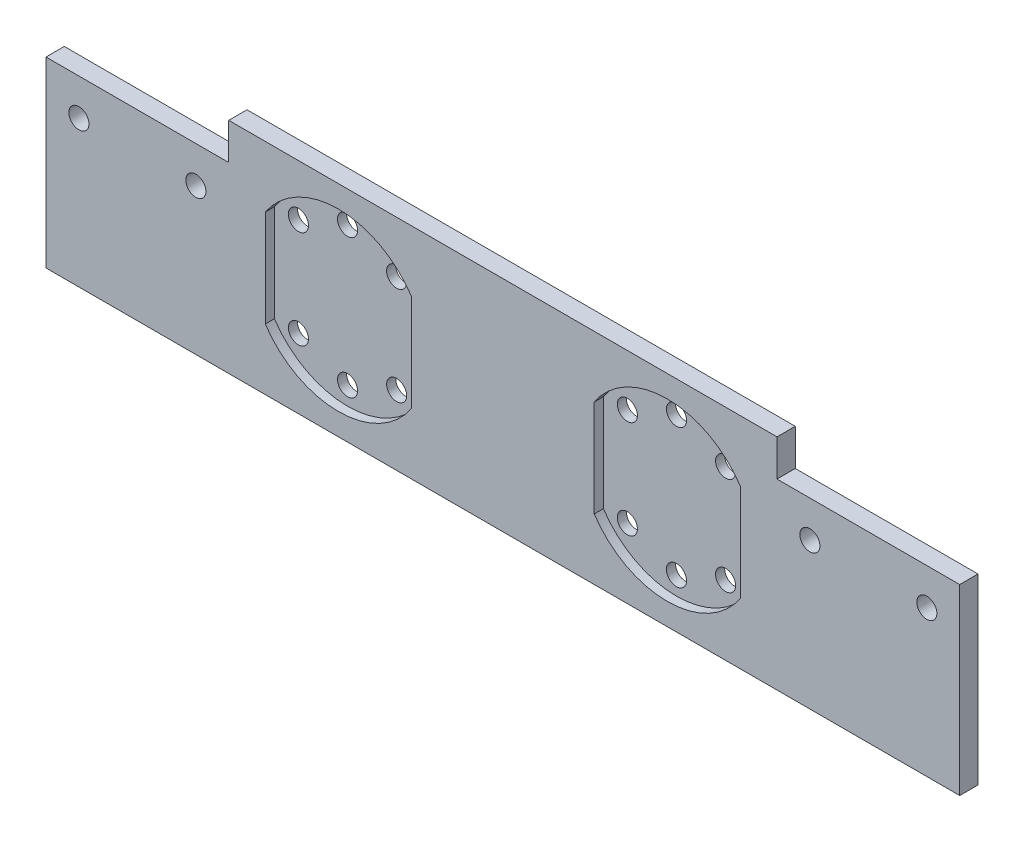
ISO-10303-21;
HEADER;
FILE_DESCRIPTION(('STEP AP214'),'2;1');
FILE_NAME('part.step','',(''),(''),'','','');
FILE_SCHEMA(('AUTOMOTIVE_DESIGN { 1 0 10303 214 1 1 1 1 }'));
ENDSEC;
DATA;
#1=APPLICATION_CONTEXT('core data for automotive mechanical design processes');
#2=APPLICATION_PROTOCOL_DEFINITION('international standard','automotive_design',2000,#1);
#3=PRODUCT_CONTEXT('',#1,'mechanical');
#4=PRODUCT('Part','Part','',(#3));
#5=PRODUCT_RELATED_PRODUCT_CATEGORY('part','',(#4));
#6=PRODUCT_DEFINITION_FORMATION('','',#4);
#7=PRODUCT_DEFINITION_CONTEXT('part definition',#1,'design');
#8=PRODUCT_DEFINITION('design','',#6,#7);
#9=PRODUCT_DEFINITION_SHAPE('','',#8);
#10=(LENGTH_UNIT() NAMED_UNIT(*) SI_UNIT(.MILLI.,.METRE.));
#11=(NAMED_UNIT(*) PLANE_ANGLE_UNIT() SI_UNIT($,.RADIAN.));
#12=(NAMED_UNIT(*) SI_UNIT($,.STERADIAN.) SOLID_ANGLE_UNIT());
#13=UNCERTAINTY_MEASURE_WITH_UNIT(LENGTH_MEASURE(1.E-05),#10,'distance_accuracy_value','');
#14=(GEOMETRIC_REPRESENTATION_CONTEXT(3) GLOBAL_UNCERTAINTY_ASSIGNED_CONTEXT((#13)) GLOBAL_UNIT_ASSIGNED_CONTEXT((#10,
#11,#12)) REPRESENTATION_CONTEXT('',''));
#15=CARTESIAN_POINT('',(0.,0.,0.));
#16=DIRECTION('',(0.,0.,1.));
#17=DIRECTION('',(1.,0.,0.));
#18=AXIS2_PLACEMENT_3D('',#15,#16,#17);
#19=CARTESIAN_POINT('',(0.,0.,0.));
#20=DIRECTION('',(0.,0.,1.));
#21=DIRECTION('',(1.,0.,0.));
#22=AXIS2_PLACEMENT_3D('',#19,#20,#21);
#23=PLANE('',#22);
#24=CARTESIAN_POINT('',(-116.,15.,0.));
#25=DIRECTION('',(0.,0.,1.));
#26=DIRECTION('',(1.,0.,0.));
#27=AXIS2_PLACEMENT_3D('',#24,#25,#26);
#28=CIRCLE('',#27,2.75000000000001);
#29=CARTESIAN_POINT('',(-113.25,15.,0.));
#30=VERTEX_POINT('',#29);
#31=EDGE_CURVE('E780',#30,#30,#28,.T.);
#32=ORIENTED_EDGE('',*,*,#31,.T.);
#33=EDGE_LOOP('',(#32));
#34=FACE_BOUND('',#33,.T.);
#35=CARTESIAN_POINT('',(116.,15.,0.));
#36=DIRECTION('',(0.,0.,1.));
#37=DIRECTION('',(-1.,0.,0.));
#38=AXIS2_PLACEMENT_3D('',#35,#36,#37);
#39=CIRCLE('',#38,2.75000000000001);
#40=CARTESIAN_POINT('',(113.25,15.,0.));
#41=VERTEX_POINT('',#40);
#42=EDGE_CURVE('E801',#41,#41,#39,.T.);
#43=ORIENTED_EDGE('',*,*,#42,.T.);
#44=EDGE_LOOP('',(#43));
#45=FACE_BOUND('',#44,.T.);
#46=CARTESIAN_POINT('',(83.9999999999996,15.,0.));
#47=DIRECTION('',(0.,0.,1.));
#48=DIRECTION('',(-1.,0.,0.));
#49=AXIS2_PLACEMENT_3D('',#46,#47,#48);
#50=CIRCLE('',#49,2.75000000000001);
#51=CARTESIAN_POINT('',(81.2499999999996,15.,0.));
#52=VERTEX_POINT('',#51);
#53=EDGE_CURVE('E795',#52,#52,#50,.T.);
#54=ORIENTED_EDGE('',*,*,#53,.T.);
#55=EDGE_LOOP('',(#54));
#56=FACE_BOUND('',#55,.T.);
#57=CARTESIAN_POINT('',(-83.9999999999996,15.,0.));
#58=DIRECTION('',(0.,0.,1.));
#59=DIRECTION('',(1.,0.,0.));
#60=AXIS2_PLACEMENT_3D('',#57,#58,#59);
#61=CIRCLE('',#60,2.75000000000001);
#62=CARTESIAN_POINT('',(-81.2499999999996,15.,0.));
#63=VERTEX_POINT('',#62);
#64=EDGE_CURVE('E790',#63,#63,#61,.T.);
#65=ORIENTED_EDGE('',*,*,#64,.T.);
#66=EDGE_LOOP('',(#65));
#67=FACE_BOUND('',#66,.T.);
#68=CARTESIAN_POINT('',(58.4400000000004,-8.43699999999997,0.));
#69=DIRECTION('',(0.,0.,1.));
#70=DIRECTION('',(1.,0.,0.));
#71=AXIS2_PLACEMENT_3D('',#68,#69,#70);
#72=CIRCLE('',#71,2.75);
#73=CARTESIAN_POINT('',(61.1900000000004,-8.43699999999997,0.));
#74=VERTEX_POINT('',#73);
#75=EDGE_CURVE('E827',#74,#74,#72,.T.);
#76=ORIENTED_EDGE('',*,*,#75,.T.);
#77=EDGE_LOOP('',(#76));
#78=FACE_BOUND('',#77,.T.);
#79=CARTESIAN_POINT('',(-31.558011299437,-8.43699999999997,0.));
#80=DIRECTION('',(0.,0.,1.));
#81=DIRECTION('',(1.,0.,0.));
#82=AXIS2_PLACEMENT_3D('',#79,#80,#81);
#83=CIRCLE('',#82,2.75);
#84=CARTESIAN_POINT('',(-28.808011299437,-8.43699999999997,0.));
#85=VERTEX_POINT('',#84);
#86=EDGE_CURVE('E822',#85,#85,#83,.T.);
#87=ORIENTED_EDGE('',*,*,#86,.T.);
#88=EDGE_LOOP('',(#87));
#89=FACE_BOUND('',#88,.T.);
#90=CARTESIAN_POINT('',(-44.9990056497187,23.9900000000001,0.));
#91=DIRECTION('',(0.,0.,1.));
#92=DIRECTION('',(1.,0.,0.));
#93=AXIS2_PLACEMENT_3D('',#90,#91,#92);
#94=CIRCLE('',#93,2.75);
#95=CARTESIAN_POINT('',(-42.2490056497187,23.9900000000001,0.));
#96=VERTEX_POINT('',#95);
#97=EDGE_CURVE('E838',#96,#96,#94,.T.);
#98=ORIENTED_EDGE('',*,*,#97,.T.);
#99=EDGE_LOOP('',(#98));
#100=FACE_BOUND('',#99,.T.);
#101=CARTESIAN_POINT('',(31.558011299437,18.4270000000001,0.));
#102=DIRECTION('',(0.,0.,1.));
#103=DIRECTION('',(1.,0.,0.));
#104=AXIS2_PLACEMENT_3D('',#101,#102,#103);
#105=CIRCLE('',#104,2.75);
#106=CARTESIAN_POINT('',(34.308011299437,18.4270000000001,0.));
#107=VERTEX_POINT('',#106);
#108=EDGE_CURVE('E810',#107,#107,#105,.T.);
#109=ORIENTED_EDGE('',*,*,#108,.T.);
#110=EDGE_LOOP('',(#109));
#111=FACE_BOUND('',#110,.T.);
#112=CARTESIAN_POINT('',(44.9990056497187,-14.,0.));
#113=DIRECTION('',(0.,0.,1.));
#114=DIRECTION('',(1.,0.,0.));
#115=AXIS2_PLACEMENT_3D('',#112,#113,#114);
#116=CIRCLE('',#115,2.75);
#117=CARTESIAN_POINT('',(47.7490056497187,-14.,0.));
#118=VERTEX_POINT('',#117);
#119=EDGE_CURVE('E808',#118,#118,#116,.T.);
#120=ORIENTED_EDGE('',*,*,#119,.T.);
#121=EDGE_LOOP('',(#120));
#122=FACE_BOUND('',#121,.T.);
#123=CARTESIAN_POINT('',(-58.4400000000004,18.4270000000001,0.));
#124=DIRECTION('',(0.,0.,1.));
#125=DIRECTION('',(1.,0.,0.));
#126=AXIS2_PLACEMENT_3D('',#123,#124,#125);
#127=CIRCLE('',#126,2.75);
#128=CARTESIAN_POINT('',(-55.6900000000004,18.4270000000001,0.));
#129=VERTEX_POINT('',#128);
#130=EDGE_CURVE('E842',#129,#129,#127,.T.);
#131=ORIENTED_EDGE('',*,*,#130,.T.);
#132=EDGE_LOOP('',(#131));
#133=FACE_BOUND('',#132,.T.);
#134=DIRECTION('',(0.,1.,0.));
#135=VECTOR('',#134,1.);
#136=CARTESIAN_POINT('',(125.,0.,0.));
#137=LINE('',#136,#135);
#138=CARTESIAN_POINT('',(125.,-25.,0.));
#139=VERTEX_POINT('',#138);
#140=CARTESIAN_POINT('',(125.,25.,0.));
#141=VERTEX_POINT('',#140);
#142=EDGE_CURVE('E11',#139,#141,#137,.T.);
#143=ORIENTED_EDGE('',*,*,#142,.F.);
#144=DIRECTION('',(1.,0.,0.));
#145=VECTOR('',#144,1.);
#146=CARTESIAN_POINT('',(-145.,-25.,0.));
#147=LINE('',#146,#145);
#148=CARTESIAN_POINT('',(-125.,-25.,0.));
#149=VERTEX_POINT('',#148);
#150=EDGE_CURVE('E322',#149,#139,#147,.T.);
#151=ORIENTED_EDGE('',*,*,#150,.F.);
#152=DIRECTION('',(0.,1.,0.));
#153=VECTOR('',#152,1.);
#154=CARTESIAN_POINT('',(-125.,0.,0.));
#155=LINE('',#154,#153);
#156=CARTESIAN_POINT('',(-125.,25.,0.));
#157=VERTEX_POINT('',#156);
#158=EDGE_CURVE('E51',#149,#157,#155,.T.);
#159=ORIENTED_EDGE('',*,*,#158,.T.);
#160=DIRECTION('',(-1.,0.,0.));
#161=VECTOR('',#160,1.);
#162=CARTESIAN_POINT('',(-145.,25.,0.));
#163=LINE('',#162,#161);
#164=CARTESIAN_POINT('',(-74.9999999999996,25.,0.));
#165=VERTEX_POINT('',#164);
#166=EDGE_CURVE('E307',#165,#157,#163,.T.);
#167=ORIENTED_EDGE('',*,*,#166,.F.);
#168=DIRECTION('',(0.,-1.,0.));
#169=VECTOR('',#168,1.);
#170=CARTESIAN_POINT('',(-74.9999999999996,35.,0.));
#171=LINE('',#170,#169);
#172=CARTESIAN_POINT('',(-74.9999999999996,35.,0.));
#173=VERTEX_POINT('',#172);
#174=EDGE_CURVE('E279',#173,#165,#171,.T.);
#175=ORIENTED_EDGE('',*,*,#174,.F.);
#176=DIRECTION('',(-1.,0.,0.));
#177=VECTOR('',#176,1.);
#178=CARTESIAN_POINT('',(74.9999999999996,35.,0.));
#179=LINE('',#178,#177);
#180=CARTESIAN_POINT('',(74.9999999999996,35.,0.));
#181=VERTEX_POINT('',#180);
#182=EDGE_CURVE('E255',#181,#173,#179,.T.);
#183=ORIENTED_EDGE('',*,*,#182,.F.);
#184=DIRECTION('',(0.,-1.,0.));
#185=VECTOR('',#184,1.);
#186=CARTESIAN_POINT('',(74.9999999999996,35.,0.));
#187=LINE('',#186,#185);
#188=CARTESIAN_POINT('',(74.9999999999996,25.,0.));
#189=VERTEX_POINT('',#188);
#190=EDGE_CURVE('E283',#181,#189,#187,.T.);
#191=ORIENTED_EDGE('',*,*,#190,.T.);
#192=EDGE_CURVE('E319',#141,#189,#163,.T.);
#193=ORIENTED_EDGE('',*,*,#192,.F.);
#194=EDGE_LOOP('',(#143,#151,#159,#167,#175,#183,#191,#193));
#195=FACE_BOUND('',#194,.T.);
#196=CARTESIAN_POINT('',(31.558011299437,-8.43699999999997,0.));
#197=DIRECTION('',(0.,0.,-1.));
#198=DIRECTION('',(-1.,0.,0.));
#199=AXIS2_PLACEMENT_3D('',#196,#197,#198);
#200=CIRCLE('',#199,2.75);
#201=CARTESIAN_POINT('',(28.808011299437,-8.43699999999997,0.));
#202=VERTEX_POINT('',#201);
#203=EDGE_CURVE('E815',#202,#202,#200,.T.);
#204=ORIENTED_EDGE('',*,*,#203,.F.);
#205=EDGE_LOOP('',(#204));
#206=FACE_BOUND('',#205,.T.);
#207=CARTESIAN_POINT('',(-31.558011299437,18.4270000000001,0.));
#208=DIRECTION('',(0.,0.,1.));
#209=DIRECTION('',(1.,0.,0.));
#210=AXIS2_PLACEMENT_3D('',#207,#208,#209);
#211=CIRCLE('',#210,2.75);
#212=CARTESIAN_POINT('',(-28.808011299437,18.4270000000001,0.));
#213=VERTEX_POINT('',#212);
#214=EDGE_CURVE('E843',#213,#213,#211,.F.);
#215=ORIENTED_EDGE('',*,*,#214,.F.);
#216=EDGE_LOOP('',(#215));
#217=FACE_BOUND('',#216,.T.);
#218=CARTESIAN_POINT('',(-58.4400000000004,-8.43699999999997,0.));
#219=DIRECTION('',(0.,0.,1.));
#220=DIRECTION('',(1.,0.,0.));
#221=AXIS2_PLACEMENT_3D('',#218,#219,#220);
#222=CIRCLE('',#221,2.75);
#223=CARTESIAN_POINT('',(-55.6900000000004,-8.43699999999997,0.));
#224=VERTEX_POINT('',#223);
#225=EDGE_CURVE('E847',#224,#224,#222,.F.);
#226=ORIENTED_EDGE('',*,*,#225,.F.);
#227=EDGE_LOOP('',(#226));
#228=FACE_BOUND('',#227,.T.);
#229=CARTESIAN_POINT('',(-44.9990056497187,-14.,0.));
#230=DIRECTION('',(0.,0.,1.));
#231=DIRECTION('',(1.,0.,0.));
#232=AXIS2_PLACEMENT_3D('',#229,#230,#231);
#233=CIRCLE('',#232,2.75);
#234=CARTESIAN_POINT('',(-42.2490056497187,-14.,0.));
#235=VERTEX_POINT('',#234);
#236=EDGE_CURVE('E826',#235,#235,#233,.F.);
#237=ORIENTED_EDGE('',*,*,#236,.F.);
#238=EDGE_LOOP('',(#237));
#239=FACE_BOUND('',#238,.T.);
#240=CARTESIAN_POINT('',(58.4400000000004,18.4270000000001,0.));
#241=DIRECTION('',(0.,0.,1.));
#242=DIRECTION('',(1.,0.,0.));
#243=AXIS2_PLACEMENT_3D('',#240,#241,#242);
#244=CIRCLE('',#243,2.75);
#245=CARTESIAN_POINT('',(61.1900000000004,18.4270000000001,0.));
#246=VERTEX_POINT('',#245);
#247=EDGE_CURVE('E831',#246,#246,#244,.F.);
#248=ORIENTED_EDGE('',*,*,#247,.F.);
#249=EDGE_LOOP('',(#248));
#250=FACE_BOUND('',#249,.T.);
#251=CARTESIAN_POINT('',(44.9990056497187,23.9900000000001,0.));
#252=DIRECTION('',(0.,0.,1.));
#253=DIRECTION('',(1.,0.,0.));
#254=AXIS2_PLACEMENT_3D('',#251,#252,#253);
#255=CIRCLE('',#254,2.75);
#256=CARTESIAN_POINT('',(47.7490056497187,23.9900000000001,0.));
#257=VERTEX_POINT('',#256);
#258=EDGE_CURVE('E814',#257,#257,#255,.F.);
#259=ORIENTED_EDGE('',*,*,#258,.F.);
#260=EDGE_LOOP('',(#259));
#261=FACE_BOUND('',#260,.T.);
#262=ADVANCED_FACE('F42',(#34,#45,#56,#67,#78,#89,#100,#111,#122,#133,#195,#206,#217,#228,#239,
#250,#261),#23,.F.);
#263=CARTESIAN_POINT('',(-145.,25.,5.));
#264=DIRECTION('',(0.,-1.,0.));
#265=DIRECTION('',(0.,0.,-1.));
#266=AXIS2_PLACEMENT_3D('',#263,#264,#265);
#267=PLANE('',#266);
#268=DIRECTION('',(0.,0.,-1.));
#269=VECTOR('',#268,1.);
#270=CARTESIAN_POINT('',(74.9999999999996,25.,0.));
#271=LINE('',#270,#269);
#272=CARTESIAN_POINT('',(74.9999999999996,25.,5.));
#273=VERTEX_POINT('',#272);
#274=EDGE_CURVE('E203',#273,#189,#271,.T.);
#275=ORIENTED_EDGE('',*,*,#274,.F.);
#276=DIRECTION('',(-1.,0.,0.));
#277=VECTOR('',#276,1.);
#278=CARTESIAN_POINT('',(-145.,25.,5.));
#279=LINE('',#278,#277);
#280=CARTESIAN_POINT('',(125.,25.,5.));
#281=VERTEX_POINT('',#280);
#282=EDGE_CURVE('E310',#281,#273,#279,.T.);
#283=ORIENTED_EDGE('',*,*,#282,.F.);
#284=DIRECTION('',(0.,0.,1.));
#285=VECTOR('',#284,1.);
#286=CARTESIAN_POINT('',(125.,25.,-5.));
#287=LINE('',#286,#285);
#288=EDGE_CURVE('E291',#141,#281,#287,.T.);
#289=ORIENTED_EDGE('',*,*,#288,.F.);
#290=ORIENTED_EDGE('',*,*,#192,.T.);
#291=EDGE_LOOP('',(#275,#283,#289,#290));
#292=FACE_BOUND('',#291,.T.);
#293=ADVANCED_FACE('F44',(#292),#267,.F.);
#294=DIRECTION('',(0.,0.,1.));
#295=VECTOR('',#294,1.);
#296=CARTESIAN_POINT('',(-74.9999999999996,25.,0.));
#297=LINE('',#296,#295);
#298=CARTESIAN_POINT('',(-74.9999999999996,25.,5.));
#299=VERTEX_POINT('',#298);
#300=EDGE_CURVE('E256',#165,#299,#297,.T.);
#301=ORIENTED_EDGE('',*,*,#300,.F.);
#302=ORIENTED_EDGE('',*,*,#166,.T.);
#303=DIRECTION('',(0.,0.,1.));
#304=VECTOR('',#303,1.);
#305=CARTESIAN_POINT('',(-125.,25.,-5.));
#306=LINE('',#305,#304);
#307=CARTESIAN_POINT('',(-125.,25.,5.));
#308=VERTEX_POINT('',#307);
#309=EDGE_CURVE('E303',#157,#308,#306,.T.);
#310=ORIENTED_EDGE('',*,*,#309,.T.);
#311=EDGE_CURVE('E315',#299,#308,#279,.T.);
#312=ORIENTED_EDGE('',*,*,#311,.F.);
#313=EDGE_LOOP('',(#301,#302,#310,#312));
#314=FACE_BOUND('',#313,.T.);
#315=ADVANCED_FACE('F345',(#314),#267,.F.);
#316=CARTESIAN_POINT('',(-145.,-25.,5.));
#317=DIRECTION('',(0.,1.,0.));
#318=DIRECTION('',(0.,0.,1.));
#319=AXIS2_PLACEMENT_3D('',#316,#317,#318);
#320=PLANE('',#319);
#321=DIRECTION('',(0.,0.,1.));
#322=VECTOR('',#321,1.);
#323=CARTESIAN_POINT('',(125.,-25.,-5.));
#324=LINE('',#323,#322);
#325=CARTESIAN_POINT('',(125.,-25.,5.));
#326=VERTEX_POINT('',#325);
#327=EDGE_CURVE('E292',#139,#326,#324,.T.);
#328=ORIENTED_EDGE('',*,*,#327,.T.);
#329=DIRECTION('',(1.,0.,0.));
#330=VECTOR('',#329,1.);
#331=CARTESIAN_POINT('',(-145.,-25.,5.));
#332=LINE('',#331,#330);
#333=CARTESIAN_POINT('',(-125.,-25.,5.));
#334=VERTEX_POINT('',#333);
#335=EDGE_CURVE('E314',#334,#326,#332,.T.);
#336=ORIENTED_EDGE('',*,*,#335,.F.);
#337=DIRECTION('',(0.,0.,1.));
#338=VECTOR('',#337,1.);
#339=CARTESIAN_POINT('',(-125.,-25.,-5.));
#340=LINE('',#339,#338);
#341=EDGE_CURVE('E302',#149,#334,#340,.T.);
#342=ORIENTED_EDGE('',*,*,#341,.F.);
#343=ORIENTED_EDGE('',*,*,#150,.T.);
#344=EDGE_LOOP('',(#328,#336,#342,#343));
#345=FACE_BOUND('',#344,.T.);
#346=ADVANCED_FACE('F340',(#345),#320,.F.);
#347=CARTESIAN_POINT('',(0.,0.,5.));
#348=DIRECTION('',(0.,0.,1.));
#349=DIRECTION('',(1.,0.,0.));
#350=AXIS2_PLACEMENT_3D('',#347,#348,#349);
#351=PLANE('',#350);
#352=CARTESIAN_POINT('',(-116.,15.,5.));
#353=DIRECTION('',(0.,0.,1.));
#354=DIRECTION('',(1.,0.,0.));
#355=AXIS2_PLACEMENT_3D('',#352,#353,#354);
#356=CIRCLE('',#355,2.75000000000001);
#357=CARTESIAN_POINT('',(-113.25,15.,5.));
#358=VERTEX_POINT('',#357);
#359=EDGE_CURVE('E783',#358,#358,#356,.T.);
#360=ORIENTED_EDGE('',*,*,#359,.F.);
#361=EDGE_LOOP('',(#360));
#362=FACE_BOUND('',#361,.T.);
#363=CARTESIAN_POINT('',(116.,15.,5.));
#364=DIRECTION('',(0.,0.,1.));
#365=DIRECTION('',(-1.,0.,0.));
#366=AXIS2_PLACEMENT_3D('',#363,#364,#365);
#367=CIRCLE('',#366,2.75000000000001);
#368=CARTESIAN_POINT('',(113.25,15.,5.));
#369=VERTEX_POINT('',#368);
#370=EDGE_CURVE('E792',#369,#369,#367,.T.);
#371=ORIENTED_EDGE('',*,*,#370,.F.);
#372=EDGE_LOOP('',(#371));
#373=FACE_BOUND('',#372,.T.);
#374=CARTESIAN_POINT('',(83.9999999999996,15.,5.));
#375=DIRECTION('',(0.,0.,1.));
#376=DIRECTION('',(-1.,0.,0.));
#377=AXIS2_PLACEMENT_3D('',#374,#375,#376);
#378=CIRCLE('',#377,2.75000000000001);
#379=CARTESIAN_POINT('',(81.2499999999996,15.,5.));
#380=VERTEX_POINT('',#379);
#381=EDGE_CURVE('E805',#380,#380,#378,.T.);
#382=ORIENTED_EDGE('',*,*,#381,.F.);
#383=EDGE_LOOP('',(#382));
#384=FACE_BOUND('',#383,.T.);
#385=CARTESIAN_POINT('',(-83.9999999999996,15.,5.));
#386=DIRECTION('',(0.,0.,1.));
#387=DIRECTION('',(1.,0.,0.));
#388=AXIS2_PLACEMENT_3D('',#385,#386,#387);
#389=CIRCLE('',#388,2.75000000000001);
#390=CARTESIAN_POINT('',(-81.2499999999996,15.,5.));
#391=VERTEX_POINT('',#390);
#392=EDGE_CURVE('E785',#391,#391,#389,.T.);
#393=ORIENTED_EDGE('',*,*,#392,.F.);
#394=EDGE_LOOP('',(#393));
#395=FACE_BOUND('',#394,.T.);
#396=CARTESIAN_POINT('',(44.9990056497187,4.99500000000005,5.));
#397=DIRECTION('',(0.,0.,1.));
#398=DIRECTION('',(-1.,0.,0.));
#399=AXIS2_PLACEMENT_3D('',#396,#397,#398);
#400=CIRCLE('',#399,24.);
#401=CARTESIAN_POINT('',(65.0000000000004,18.26,5.));
#402=VERTEX_POINT('',#401);
#403=CARTESIAN_POINT('',(25.0000000000004,18.2629980789317,5.));
#404=VERTEX_POINT('',#403);
#405=EDGE_CURVE('E58',#402,#404,#400,.T.);
#406=ORIENTED_EDGE('',*,*,#405,.F.);
#407=DIRECTION('',(0.,1.,0.));
#408=VECTOR('',#407,1.);
#409=CARTESIAN_POINT('',(65.0000000000004,18.26,5.));
#410=LINE('',#409,#408);
#411=CARTESIAN_POINT('',(65.0000000000004,-8.26999999999996,5.));
#412=VERTEX_POINT('',#411);
#413=EDGE_CURVE('E178',#412,#402,#410,.T.);
#414=ORIENTED_EDGE('',*,*,#413,.F.);
#415=CARTESIAN_POINT('',(44.9990056497187,4.99500000000005,5.));
#416=DIRECTION('',(0.,0.,1.));
#417=DIRECTION('',(1.,0.,0.));
#418=AXIS2_PLACEMENT_3D('',#415,#416,#417);
#419=CIRCLE('',#418,24.);
#420=CARTESIAN_POINT('',(25.0000000000003,-8.27299807893163,5.));
#421=VERTEX_POINT('',#420);
#422=EDGE_CURVE('E182',#421,#412,#419,.T.);
#423=ORIENTED_EDGE('',*,*,#422,.F.);
#424=DIRECTION('',(0.,-1.,0.));
#425=VECTOR('',#424,1.);
#426=CARTESIAN_POINT('',(25.0000000000004,18.2629980789317,5.));
#427=LINE('',#426,#425);
#428=EDGE_CURVE('E194',#404,#421,#427,.T.);
#429=ORIENTED_EDGE('',*,*,#428,.F.);
#430=EDGE_LOOP('',(#406,#414,#423,#429));
#431=FACE_BOUND('',#430,.T.);
#432=CARTESIAN_POINT('',(-44.9990056497187,4.99500000000005,5.));
#433=DIRECTION('',(0.,0.,1.));
#434=DIRECTION('',(-1.,0.,0.));
#435=AXIS2_PLACEMENT_3D('',#432,#433,#434);
#436=CIRCLE('',#435,24.);
#437=CARTESIAN_POINT('',(-65.0000000000004,-8.26999999999996,5.));
#438=VERTEX_POINT('',#437);
#439=CARTESIAN_POINT('',(-25.0000000000004,-8.27299807893163,5.));
#440=VERTEX_POINT('',#439);
#441=EDGE_CURVE('E66',#438,#440,#436,.T.);
#442=ORIENTED_EDGE('',*,*,#441,.F.);
#443=DIRECTION('',(0.,-1.,0.));
#444=VECTOR('',#443,1.);
#445=CARTESIAN_POINT('',(-65.0000000000004,18.26,5.));
#446=LINE('',#445,#444);
#447=CARTESIAN_POINT('',(-65.0000000000004,18.26,5.));
#448=VERTEX_POINT('',#447);
#449=EDGE_CURVE('E222',#448,#438,#446,.T.);
#450=ORIENTED_EDGE('',*,*,#449,.F.);
#451=CARTESIAN_POINT('',(-44.9990056497187,4.99500000000005,5.));
#452=DIRECTION('',(0.,0.,1.));
#453=DIRECTION('',(1.,0.,0.));
#454=AXIS2_PLACEMENT_3D('',#451,#452,#453);
#455=CIRCLE('',#454,24.);
#456=CARTESIAN_POINT('',(-25.0000000000004,18.2629980789317,5.));
#457=VERTEX_POINT('',#456);
#458=EDGE_CURVE('E226',#457,#448,#455,.T.);
#459=ORIENTED_EDGE('',*,*,#458,.F.);
#460=DIRECTION('',(0.,1.,0.));
#461=VECTOR('',#460,1.);
#462=CARTESIAN_POINT('',(-25.0000000000004,18.2629980789317,5.));
#463=LINE('',#462,#461);
#464=EDGE_CURVE('E231',#440,#457,#463,.T.);
#465=ORIENTED_EDGE('',*,*,#464,.F.);
#466=EDGE_LOOP('',(#442,#450,#459,#465));
#467=FACE_BOUND('',#466,.T.);
#468=ORIENTED_EDGE('',*,*,#335,.T.);
#469=DIRECTION('',(0.,1.,0.));
#470=VECTOR('',#469,1.);
#471=CARTESIAN_POINT('',(125.,25.,5.));
#472=LINE('',#471,#470);
#473=EDGE_CURVE('E287',#326,#281,#472,.T.);
#474=ORIENTED_EDGE('',*,*,#473,.T.);
#475=ORIENTED_EDGE('',*,*,#282,.T.);
#476=DIRECTION('',(0.,-1.,0.));
#477=VECTOR('',#476,1.);
#478=CARTESIAN_POINT('',(74.9999999999996,35.,5.));
#479=LINE('',#478,#477);
#480=CARTESIAN_POINT('',(74.9999999999996,35.,5.));
#481=VERTEX_POINT('',#480);
#482=EDGE_CURVE('E265',#481,#273,#479,.T.);
#483=ORIENTED_EDGE('',*,*,#482,.F.);
#484=DIRECTION('',(1.,0.,0.));
#485=VECTOR('',#484,1.);
#486=CARTESIAN_POINT('',(74.9999999999996,35.,5.));
#487=LINE('',#486,#485);
#488=CARTESIAN_POINT('',(-74.9999999999996,35.,5.));
#489=VERTEX_POINT('',#488);
#490=EDGE_CURVE('E262',#489,#481,#487,.T.);
#491=ORIENTED_EDGE('',*,*,#490,.F.);
#492=DIRECTION('',(0.,-1.,0.));
#493=VECTOR('',#492,1.);
#494=CARTESIAN_POINT('',(-74.9999999999996,35.,5.));
#495=LINE('',#494,#493);
#496=EDGE_CURVE('E275',#489,#299,#495,.T.);
#497=ORIENTED_EDGE('',*,*,#496,.T.);
#498=ORIENTED_EDGE('',*,*,#311,.T.);
#499=DIRECTION('',(0.,1.,0.));
#500=VECTOR('',#499,1.);
#501=CARTESIAN_POINT('',(-125.,25.,5.));
#502=LINE('',#501,#500);
#503=EDGE_CURVE('E296',#334,#308,#502,.T.);
#504=ORIENTED_EDGE('',*,*,#503,.F.);
#505=EDGE_LOOP('',(#468,#474,#475,#483,#491,#497,#498,#504));
#506=FACE_BOUND('',#505,.T.);
#507=ADVANCED_FACE('F342',(#362,#373,#384,#395,#431,#467,#506),#351,.T.);
#508=CARTESIAN_POINT('',(-125.,25.,-5.));
#509=DIRECTION('',(1.,0.,0.));
#510=DIRECTION('',(0.,1.,0.));
#511=AXIS2_PLACEMENT_3D('',#508,#509,#510);
#512=PLANE('',#511);
#513=ORIENTED_EDGE('',*,*,#341,.T.);
#514=ORIENTED_EDGE('',*,*,#503,.T.);
#515=ORIENTED_EDGE('',*,*,#309,.F.);
#516=ORIENTED_EDGE('',*,*,#158,.F.);
#517=EDGE_LOOP('',(#513,#514,#515,#516));
#518=FACE_BOUND('',#517,.T.);
#519=ADVANCED_FACE('F336',(#518),#512,.F.);
#520=CARTESIAN_POINT('',(125.,25.,-5.));
#521=DIRECTION('',(1.,0.,0.));
#522=DIRECTION('',(0.,1.,0.));
#523=AXIS2_PLACEMENT_3D('',#520,#521,#522);
#524=PLANE('',#523);
#525=ORIENTED_EDGE('',*,*,#142,.T.);
#526=ORIENTED_EDGE('',*,*,#288,.T.);
#527=ORIENTED_EDGE('',*,*,#473,.F.);
#528=ORIENTED_EDGE('',*,*,#327,.F.);
#529=EDGE_LOOP('',(#525,#526,#527,#528));
#530=FACE_BOUND('',#529,.T.);
#531=ADVANCED_FACE('F364',(#530),#524,.T.);
#532=CARTESIAN_POINT('',(74.9999999999996,35.,0.));
#533=DIRECTION('',(-1.,0.,0.));
#534=DIRECTION('',(0.,0.,1.));
#535=AXIS2_PLACEMENT_3D('',#532,#533,#534);
#536=PLANE('',#535);
#537=ORIENTED_EDGE('',*,*,#274,.T.);
#538=ORIENTED_EDGE('',*,*,#190,.F.);
#539=DIRECTION('',(0.,0.,-1.));
#540=VECTOR('',#539,1.);
#541=CARTESIAN_POINT('',(74.9999999999996,35.,0.));
#542=LINE('',#541,#540);
#543=EDGE_CURVE('E251',#481,#181,#542,.T.);
#544=ORIENTED_EDGE('',*,*,#543,.F.);
#545=ORIENTED_EDGE('',*,*,#482,.T.);
#546=EDGE_LOOP('',(#537,#538,#544,#545));
#547=FACE_BOUND('',#546,.T.);
#548=ADVANCED_FACE('F360',(#547),#536,.F.);
#549=CARTESIAN_POINT('',(-74.9999999999996,35.,0.));
#550=DIRECTION('',(1.,0.,0.));
#551=DIRECTION('',(0.,0.,-1.));
#552=AXIS2_PLACEMENT_3D('',#549,#550,#551);
#553=PLANE('',#552);
#554=ORIENTED_EDGE('',*,*,#300,.T.);
#555=ORIENTED_EDGE('',*,*,#496,.F.);
#556=DIRECTION('',(0.,0.,1.));
#557=VECTOR('',#556,1.);
#558=CARTESIAN_POINT('',(-74.9999999999996,35.,0.));
#559=LINE('',#558,#557);
#560=EDGE_CURVE('E259',#173,#489,#559,.T.);
#561=ORIENTED_EDGE('',*,*,#560,.F.);
#562=ORIENTED_EDGE('',*,*,#174,.T.);
#563=EDGE_LOOP('',(#554,#555,#561,#562));
#564=FACE_BOUND('',#563,.T.);
#565=ADVANCED_FACE('F350',(#564),#553,.F.);
#566=CARTESIAN_POINT('',(0.,35.,0.));
#567=DIRECTION('',(0.,-1.,0.));
#568=DIRECTION('',(0.,0.,-1.));
#569=AXIS2_PLACEMENT_3D('',#566,#567,#568);
#570=PLANE('',#569);
#571=ORIENTED_EDGE('',*,*,#543,.T.);
#572=ORIENTED_EDGE('',*,*,#182,.T.);
#573=ORIENTED_EDGE('',*,*,#560,.T.);
#574=ORIENTED_EDGE('',*,*,#490,.T.);
#575=EDGE_LOOP('',(#571,#572,#573,#574));
#576=FACE_BOUND('',#575,.T.);
#577=ADVANCED_FACE('F356',(#576),#570,.F.);
#578=CARTESIAN_POINT('',(-44.9990056497187,4.99500000000005,2.5));
#579=DIRECTION('',(0.,0.,1.));
#580=DIRECTION('',(1.,0.,0.));
#581=AXIS2_PLACEMENT_3D('',#578,#579,#580);
#582=CYLINDRICAL_SURFACE('',#581,24.);
#583=ORIENTED_EDGE('',*,*,#441,.T.);
#584=DIRECTION('',(0.,0.,1.));
#585=VECTOR('',#584,1.);
#586=CARTESIAN_POINT('',(-25.0000000000004,-8.27299807893163,2.5));
#587=LINE('',#586,#585);
#588=CARTESIAN_POINT('',(-25.0000000000004,-8.27299807893163,2.5));
#589=VERTEX_POINT('',#588);
#590=EDGE_CURVE('E209',#589,#440,#587,.T.);
#591=ORIENTED_EDGE('',*,*,#590,.F.);
#592=CARTESIAN_POINT('',(-44.9990056497187,4.99500000000005,2.5));
#593=DIRECTION('',(0.,0.,1.));
#594=DIRECTION('',(-1.,0.,0.));
#595=AXIS2_PLACEMENT_3D('',#592,#593,#594);
#596=CIRCLE('',#595,24.);
#597=CARTESIAN_POINT('',(-65.0000000000004,-8.26999999999996,2.5));
#598=VERTEX_POINT('',#597);
#599=EDGE_CURVE('E227',#598,#589,#596,.T.);
#600=ORIENTED_EDGE('',*,*,#599,.F.);
#601=DIRECTION('',(0.,0.,1.));
#602=VECTOR('',#601,1.);
#603=CARTESIAN_POINT('',(-65.0000000000004,-8.26999999999996,2.5));
#604=LINE('',#603,#602);
#605=EDGE_CURVE('E219',#598,#438,#604,.T.);
#606=ORIENTED_EDGE('',*,*,#605,.T.);
#607=EDGE_LOOP('',(#583,#591,#600,#606));
#608=FACE_BOUND('',#607,.T.);
#609=ADVANCED_FACE('F419',(#608),#582,.F.);
#610=CARTESIAN_POINT('',(-65.0000000000004,18.26,2.5));
#611=DIRECTION('',(-1.,0.,0.));
#612=DIRECTION('',(0.,-1.,0.));
#613=AXIS2_PLACEMENT_3D('',#610,#611,#612);
#614=PLANE('',#613);
#615=ORIENTED_EDGE('',*,*,#449,.T.);
#616=ORIENTED_EDGE('',*,*,#605,.F.);
#617=DIRECTION('',(0.,-1.,0.));
#618=VECTOR('',#617,1.);
#619=CARTESIAN_POINT('',(-65.0000000000004,18.26,2.5));
#620=LINE('',#619,#618);
#621=CARTESIAN_POINT('',(-65.0000000000004,18.26,2.5));
#622=VERTEX_POINT('',#621);
#623=EDGE_CURVE('E212',#622,#598,#620,.T.);
#624=ORIENTED_EDGE('',*,*,#623,.F.);
#625=DIRECTION('',(0.,0.,1.));
#626=VECTOR('',#625,1.);
#627=CARTESIAN_POINT('',(-65.0000000000004,18.26,2.5));
#628=LINE('',#627,#626);
#629=EDGE_CURVE('E216',#622,#448,#628,.T.);
#630=ORIENTED_EDGE('',*,*,#629,.T.);
#631=EDGE_LOOP('',(#615,#616,#624,#630));
#632=FACE_BOUND('',#631,.T.);
#633=ADVANCED_FACE('F429',(#632),#614,.F.);
#634=CARTESIAN_POINT('',(-44.9990056497187,4.99500000000005,2.5));
#635=DIRECTION('',(0.,0.,1.));
#636=DIRECTION('',(1.,0.,0.));
#637=AXIS2_PLACEMENT_3D('',#634,#635,#636);
#638=CYLINDRICAL_SURFACE('',#637,24.);
#639=ORIENTED_EDGE('',*,*,#458,.T.);
#640=ORIENTED_EDGE('',*,*,#629,.F.);
#641=CARTESIAN_POINT('',(-44.9990056497187,4.99500000000005,2.5));
#642=DIRECTION('',(0.,0.,1.));
#643=DIRECTION('',(1.,0.,0.));
#644=AXIS2_PLACEMENT_3D('',#641,#642,#643);
#645=CIRCLE('',#644,24.);
#646=CARTESIAN_POINT('',(-25.0000000000004,18.2629980789317,2.5));
#647=VERTEX_POINT('',#646);
#648=EDGE_CURVE('E240',#647,#622,#645,.T.);
#649=ORIENTED_EDGE('',*,*,#648,.F.);
#650=DIRECTION('',(0.,0.,1.));
#651=VECTOR('',#650,1.);
#652=CARTESIAN_POINT('',(-25.0000000000004,18.2629980789317,2.5));
#653=LINE('',#652,#651);
#654=EDGE_CURVE('E213',#647,#457,#653,.T.);
#655=ORIENTED_EDGE('',*,*,#654,.T.);
#656=EDGE_LOOP('',(#639,#640,#649,#655));
#657=FACE_BOUND('',#656,.T.);
#658=ADVANCED_FACE('F439',(#657),#638,.F.);
#659=CARTESIAN_POINT('',(-25.0000000000004,18.2629980789317,2.5));
#660=DIRECTION('',(1.,0.,0.));
#661=DIRECTION('',(0.,0.,-1.));
#662=AXIS2_PLACEMENT_3D('',#659,#660,#661);
#663=PLANE('',#662);
#664=ORIENTED_EDGE('',*,*,#464,.T.);
#665=ORIENTED_EDGE('',*,*,#654,.F.);
#666=DIRECTION('',(0.,1.,0.));
#667=VECTOR('',#666,1.);
#668=CARTESIAN_POINT('',(-25.0000000000004,18.2629980789317,2.5));
#669=LINE('',#668,#667);
#670=EDGE_CURVE('E244',#589,#647,#669,.T.);
#671=ORIENTED_EDGE('',*,*,#670,.F.);
#672=ORIENTED_EDGE('',*,*,#590,.T.);
#673=EDGE_LOOP('',(#664,#665,#671,#672));
#674=FACE_BOUND('',#673,.T.);
#675=ADVANCED_FACE('F450',(#674),#663,.F.);
#676=CARTESIAN_POINT('',(-44.9990056497187,4.99500000000005,2.5));
#677=DIRECTION('',(0.,0.,-1.));
#678=DIRECTION('',(-1.,0.,0.));
#679=AXIS2_PLACEMENT_3D('',#676,#677,#678);
#680=PLANE('',#679);
#681=CARTESIAN_POINT('',(-58.4400000000004,-8.43699999999997,2.5));
#682=DIRECTION('',(0.,0.,-1.));
#683=DIRECTION('',(-1.,0.,0.));
#684=AXIS2_PLACEMENT_3D('',#681,#682,#683);
#685=CIRCLE('',#684,2.75);
#686=CARTESIAN_POINT('',(-61.1900000000004,-8.43699999999997,2.5));
#687=VERTEX_POINT('',#686);
#688=EDGE_CURVE('E861',#687,#687,#685,.F.);
#689=ORIENTED_EDGE('',*,*,#688,.F.);
#690=EDGE_LOOP('',(#689));
#691=FACE_BOUND('',#690,.T.);
#692=CARTESIAN_POINT('',(-31.558011299437,-8.43699999999997,2.5));
#693=DIRECTION('',(0.,0.,-1.));
#694=DIRECTION('',(-1.,0.,0.));
#695=AXIS2_PLACEMENT_3D('',#692,#693,#694);
#696=CIRCLE('',#695,2.75);
#697=CARTESIAN_POINT('',(-34.308011299437,-8.43699999999997,2.5));
#698=VERTEX_POINT('',#697);
#699=EDGE_CURVE('E185',#698,#698,#696,.T.);
#700=ORIENTED_EDGE('',*,*,#699,.T.);
#701=EDGE_LOOP('',(#700));
#702=FACE_BOUND('',#701,.T.);
#703=CARTESIAN_POINT('',(-44.9990056497187,-14.,2.5));
#704=DIRECTION('',(0.,0.,-1.));
#705=DIRECTION('',(-1.,0.,0.));
#706=AXIS2_PLACEMENT_3D('',#703,#704,#705);
#707=CIRCLE('',#706,2.75);
#708=CARTESIAN_POINT('',(-47.7490056497187,-14.,2.5));
#709=VERTEX_POINT('',#708);
#710=EDGE_CURVE('E896',#709,#709,#707,.F.);
#711=ORIENTED_EDGE('',*,*,#710,.F.);
#712=EDGE_LOOP('',(#711));
#713=FACE_BOUND('',#712,.T.);
#714=CARTESIAN_POINT('',(-58.4400000000004,18.4270000000001,2.5));
#715=DIRECTION('',(0.,0.,-1.));
#716=DIRECTION('',(-1.,0.,0.));
#717=AXIS2_PLACEMENT_3D('',#714,#715,#716);
#718=CIRCLE('',#717,2.75);
#719=CARTESIAN_POINT('',(-61.1900000000004,18.4270000000001,2.5));
#720=VERTEX_POINT('',#719);
#721=EDGE_CURVE('E893',#720,#720,#718,.T.);
#722=ORIENTED_EDGE('',*,*,#721,.T.);
#723=EDGE_LOOP('',(#722));
#724=FACE_BOUND('',#723,.T.);
#725=CARTESIAN_POINT('',(-44.9990056497187,23.9900000000001,2.5));
#726=DIRECTION('',(0.,0.,-1.));
#727=DIRECTION('',(-1.,0.,0.));
#728=AXIS2_PLACEMENT_3D('',#725,#726,#727);
#729=CIRCLE('',#728,2.75);
#730=CARTESIAN_POINT('',(-47.7490056497187,23.9900000000001,2.5));
#731=VERTEX_POINT('',#730);
#732=EDGE_CURVE('E889',#731,#731,#729,.T.);
#733=ORIENTED_EDGE('',*,*,#732,.T.);
#734=EDGE_LOOP('',(#733));
#735=FACE_BOUND('',#734,.T.);
#736=CARTESIAN_POINT('',(-31.558011299437,18.4270000000001,2.5));
#737=DIRECTION('',(0.,0.,-1.));
#738=DIRECTION('',(-1.,0.,0.));
#739=AXIS2_PLACEMENT_3D('',#736,#737,#738);
#740=CIRCLE('',#739,2.75);
#741=CARTESIAN_POINT('',(-34.308011299437,18.4270000000001,2.5));
#742=VERTEX_POINT('',#741);
#743=EDGE_CURVE('E885',#742,#742,#740,.F.);
#744=ORIENTED_EDGE('',*,*,#743,.F.);
#745=EDGE_LOOP('',(#744));
#746=FACE_BOUND('',#745,.T.);
#747=ORIENTED_EDGE('',*,*,#599,.T.);
#748=ORIENTED_EDGE('',*,*,#670,.T.);
#749=ORIENTED_EDGE('',*,*,#648,.T.);
#750=ORIENTED_EDGE('',*,*,#623,.T.);
#751=EDGE_LOOP('',(#747,#748,#749,#750));
#752=FACE_BOUND('',#751,.T.);
#753=ADVANCED_FACE('F461',(#691,#702,#713,#724,#735,#746,#752),#680,.F.);
#754=CARTESIAN_POINT('',(44.9990056497187,4.99500000000005,2.5));
#755=DIRECTION('',(0.,0.,1.));
#756=DIRECTION('',(1.,0.,0.));
#757=AXIS2_PLACEMENT_3D('',#754,#755,#756);
#758=CYLINDRICAL_SURFACE('',#757,24.);
#759=ORIENTED_EDGE('',*,*,#405,.T.);
#760=DIRECTION('',(0.,0.,1.));
#761=VECTOR('',#760,1.);
#762=CARTESIAN_POINT('',(25.0000000000004,18.2629980789317,2.5));
#763=LINE('',#762,#761);
#764=CARTESIAN_POINT('',(25.0000000000004,18.2629980789317,2.5));
#765=VERTEX_POINT('',#764);
#766=EDGE_CURVE('E153',#765,#404,#763,.T.);
#767=ORIENTED_EDGE('',*,*,#766,.F.);
#768=CARTESIAN_POINT('',(44.9990056497187,4.99500000000005,2.5));
#769=DIRECTION('',(0.,0.,1.));
#770=DIRECTION('',(-1.,0.,0.));
#771=AXIS2_PLACEMENT_3D('',#768,#769,#770);
#772=CIRCLE('',#771,24.);
#773=CARTESIAN_POINT('',(65.0000000000004,18.26,2.5));
#774=VERTEX_POINT('',#773);
#775=EDGE_CURVE('E157',#774,#765,#772,.T.);
#776=ORIENTED_EDGE('',*,*,#775,.F.);
#777=DIRECTION('',(0.,0.,1.));
#778=VECTOR('',#777,1.);
#779=CARTESIAN_POINT('',(65.0000000000004,18.26,2.5));
#780=LINE('',#779,#778);
#781=EDGE_CURVE('E200',#774,#402,#780,.T.);
#782=ORIENTED_EDGE('',*,*,#781,.T.);
#783=EDGE_LOOP('',(#759,#767,#776,#782));
#784=FACE_BOUND('',#783,.T.);
#785=ADVANCED_FACE('F155',(#784),#758,.F.);
#786=CARTESIAN_POINT('',(65.0000000000004,18.26,2.5));
#787=DIRECTION('',(1.,0.,0.));
#788=DIRECTION('',(0.,1.,0.));
#789=AXIS2_PLACEMENT_3D('',#786,#787,#788);
#790=PLANE('',#789);
#791=ORIENTED_EDGE('',*,*,#413,.T.);
#792=ORIENTED_EDGE('',*,*,#781,.F.);
#793=DIRECTION('',(0.,1.,0.));
#794=VECTOR('',#793,1.);
#795=CARTESIAN_POINT('',(65.0000000000004,18.26,2.5));
#796=LINE('',#795,#794);
#797=CARTESIAN_POINT('',(65.0000000000004,-8.26999999999996,2.5));
#798=VERTEX_POINT('',#797);
#799=EDGE_CURVE('E164',#798,#774,#796,.T.);
#800=ORIENTED_EDGE('',*,*,#799,.F.);
#801=DIRECTION('',(0.,0.,1.));
#802=VECTOR('',#801,1.);
#803=CARTESIAN_POINT('',(65.0000000000004,-8.26999999999996,2.5));
#804=LINE('',#803,#802);
#805=EDGE_CURVE('E204',#798,#412,#804,.T.);
#806=ORIENTED_EDGE('',*,*,#805,.T.);
#807=EDGE_LOOP('',(#791,#792,#800,#806));
#808=FACE_BOUND('',#807,.T.);
#809=ADVANCED_FACE('F482',(#808),#790,.F.);
#810=CARTESIAN_POINT('',(44.9990056497187,4.99500000000005,2.5));
#811=DIRECTION('',(0.,0.,1.));
#812=DIRECTION('',(1.,0.,0.));
#813=AXIS2_PLACEMENT_3D('',#810,#811,#812);
#814=CYLINDRICAL_SURFACE('',#813,24.);
#815=ORIENTED_EDGE('',*,*,#422,.T.);
#816=ORIENTED_EDGE('',*,*,#805,.F.);
#817=CARTESIAN_POINT('',(44.9990056497187,4.99500000000005,2.5));
#818=DIRECTION('',(0.,0.,1.));
#819=DIRECTION('',(1.,0.,0.));
#820=AXIS2_PLACEMENT_3D('',#817,#818,#819);
#821=CIRCLE('',#820,24.);
#822=CARTESIAN_POINT('',(25.0000000000003,-8.27299807893163,2.5));
#823=VERTEX_POINT('',#822);
#824=EDGE_CURVE('E173',#823,#798,#821,.T.);
#825=ORIENTED_EDGE('',*,*,#824,.F.);
#826=DIRECTION('',(0.,0.,1.));
#827=VECTOR('',#826,1.);
#828=CARTESIAN_POINT('',(25.0000000000003,-8.27299807893163,2.5));
#829=LINE('',#828,#827);
#830=EDGE_CURVE('E163',#823,#421,#829,.T.);
#831=ORIENTED_EDGE('',*,*,#830,.T.);
#832=EDGE_LOOP('',(#815,#816,#825,#831));
#833=FACE_BOUND('',#832,.T.);
#834=ADVANCED_FACE('F492',(#833),#814,.F.);
#835=CARTESIAN_POINT('',(25.0000000000004,18.2629980789317,2.5));
#836=DIRECTION('',(-1.,0.,0.));
#837=DIRECTION('',(0.,0.,1.));
#838=AXIS2_PLACEMENT_3D('',#835,#836,#837);
#839=PLANE('',#838);
#840=ORIENTED_EDGE('',*,*,#428,.T.);
#841=ORIENTED_EDGE('',*,*,#830,.F.);
#842=DIRECTION('',(0.,-1.,0.));
#843=VECTOR('',#842,1.);
#844=CARTESIAN_POINT('',(25.0000000000004,18.2629980789317,2.5));
#845=LINE('',#844,#843);
#846=EDGE_CURVE('E167',#765,#823,#845,.T.);
#847=ORIENTED_EDGE('',*,*,#846,.F.);
#848=ORIENTED_EDGE('',*,*,#766,.T.);
#849=EDGE_LOOP('',(#840,#841,#847,#848));
#850=FACE_BOUND('',#849,.T.);
#851=ADVANCED_FACE('F168',(#850),#839,.F.);
#852=CARTESIAN_POINT('',(44.9990056497187,4.99500000000005,2.5));
#853=DIRECTION('',(0.,0.,-1.));
#854=DIRECTION('',(-1.,0.,0.));
#855=AXIS2_PLACEMENT_3D('',#852,#853,#854);
#856=PLANE('',#855);
#857=CARTESIAN_POINT('',(31.558011299437,18.4270000000001,2.5));
#858=DIRECTION('',(0.,0.,-1.));
#859=DIRECTION('',(-1.,0.,0.));
#860=AXIS2_PLACEMENT_3D('',#857,#858,#859);
#861=CIRCLE('',#860,2.75);
#862=CARTESIAN_POINT('',(28.808011299437,18.4270000000001,2.5));
#863=VERTEX_POINT('',#862);
#864=EDGE_CURVE('E857',#863,#863,#861,.T.);
#865=ORIENTED_EDGE('',*,*,#864,.T.);
#866=EDGE_LOOP('',(#865));
#867=FACE_BOUND('',#866,.T.);
#868=CARTESIAN_POINT('',(44.9990056497187,23.9900000000001,2.5));
#869=DIRECTION('',(0.,0.,-1.));
#870=DIRECTION('',(-1.,0.,0.));
#871=AXIS2_PLACEMENT_3D('',#868,#869,#870);
#872=CIRCLE('',#871,2.75);
#873=CARTESIAN_POINT('',(42.2490056497187,23.9900000000001,2.5));
#874=VERTEX_POINT('',#873);
#875=EDGE_CURVE('E881',#874,#874,#872,.F.);
#876=ORIENTED_EDGE('',*,*,#875,.F.);
#877=EDGE_LOOP('',(#876));
#878=FACE_BOUND('',#877,.T.);
#879=CARTESIAN_POINT('',(58.4400000000004,18.4270000000001,2.5));
#880=DIRECTION('',(0.,0.,-1.));
#881=DIRECTION('',(-1.,0.,0.));
#882=AXIS2_PLACEMENT_3D('',#879,#880,#881);
#883=CIRCLE('',#882,2.75);
#884=CARTESIAN_POINT('',(55.6900000000004,18.4270000000001,2.5));
#885=VERTEX_POINT('',#884);
#886=EDGE_CURVE('E877',#885,#885,#883,.F.);
#887=ORIENTED_EDGE('',*,*,#886,.F.);
#888=EDGE_LOOP('',(#887));
#889=FACE_BOUND('',#888,.T.);
#890=CARTESIAN_POINT('',(44.9990056497187,-14.,2.5));
#891=DIRECTION('',(0.,0.,-1.));
#892=DIRECTION('',(-1.,0.,0.));
#893=AXIS2_PLACEMENT_3D('',#890,#891,#892);
#894=CIRCLE('',#893,2.75);
#895=CARTESIAN_POINT('',(42.2490056497187,-14.,2.5));
#896=VERTEX_POINT('',#895);
#897=EDGE_CURVE('E873',#896,#896,#894,.T.);
#898=ORIENTED_EDGE('',*,*,#897,.T.);
#899=EDGE_LOOP('',(#898));
#900=FACE_BOUND('',#899,.T.);
#901=CARTESIAN_POINT('',(31.558011299437,-8.43699999999997,2.5));
#902=DIRECTION('',(0.,0.,-1.));
#903=DIRECTION('',(-1.,0.,0.));
#904=AXIS2_PLACEMENT_3D('',#901,#902,#903);
#905=CIRCLE('',#904,2.75);
#906=CARTESIAN_POINT('',(28.808011299437,-8.43699999999997,2.5));
#907=VERTEX_POINT('',#906);
#908=EDGE_CURVE('E869',#907,#907,#905,.F.);
#909=ORIENTED_EDGE('',*,*,#908,.F.);
#910=EDGE_LOOP('',(#909));
#911=FACE_BOUND('',#910,.T.);
#912=CARTESIAN_POINT('',(58.4400000000004,-8.43699999999997,2.5));
#913=DIRECTION('',(0.,0.,-1.));
#914=DIRECTION('',(-1.,0.,0.));
#915=AXIS2_PLACEMENT_3D('',#912,#913,#914);
#916=CIRCLE('',#915,2.75);
#917=CARTESIAN_POINT('',(55.6900000000004,-8.43699999999997,2.5));
#918=VERTEX_POINT('',#917);
#919=EDGE_CURVE('E865',#918,#918,#916,.T.);
#920=ORIENTED_EDGE('',*,*,#919,.T.);
#921=EDGE_LOOP('',(#920));
#922=FACE_BOUND('',#921,.T.);
#923=ORIENTED_EDGE('',*,*,#775,.T.);
#924=ORIENTED_EDGE('',*,*,#846,.T.);
#925=ORIENTED_EDGE('',*,*,#824,.T.);
#926=ORIENTED_EDGE('',*,*,#799,.T.);
#927=EDGE_LOOP('',(#923,#924,#925,#926));
#928=FACE_BOUND('',#927,.T.);
#929=ADVANCED_FACE('F175',(#867,#878,#889,#900,#911,#922,#928),#856,.F.);
#930=CARTESIAN_POINT('',(44.9990056497187,-14.,0.));
#931=DIRECTION('',(0.,0.,1.));
#932=DIRECTION('',(1.,0.,0.));
#933=AXIS2_PLACEMENT_3D('',#930,#931,#932);
#934=CYLINDRICAL_SURFACE('',#933,2.75);
#935=ORIENTED_EDGE('',*,*,#119,.F.);
#936=EDGE_LOOP('',(#935));
#937=FACE_BOUND('',#936,.T.);
#938=ORIENTED_EDGE('',*,*,#897,.F.);
#939=EDGE_LOOP('',(#938));
#940=FACE_BOUND('',#939,.T.);
#941=ADVANCED_FACE('F522',(#937,#940),#934,.F.);
#942=CARTESIAN_POINT('',(31.558011299437,-8.43699999999997,0.));
#943=DIRECTION('',(0.,0.,1.));
#944=DIRECTION('',(1.,0.,0.));
#945=AXIS2_PLACEMENT_3D('',#942,#943,#944);
#946=CYLINDRICAL_SURFACE('',#945,2.75);
#947=ORIENTED_EDGE('',*,*,#203,.T.);
#948=EDGE_LOOP('',(#947));
#949=FACE_BOUND('',#948,.T.);
#950=ORIENTED_EDGE('',*,*,#908,.T.);
#951=EDGE_LOOP('',(#950));
#952=FACE_BOUND('',#951,.T.);
#953=ADVANCED_FACE('F534',(#949,#952),#946,.F.);
#954=CARTESIAN_POINT('',(31.558011299437,18.4270000000001,0.));
#955=DIRECTION('',(0.,0.,1.));
#956=DIRECTION('',(1.,0.,0.));
#957=AXIS2_PLACEMENT_3D('',#954,#955,#956);
#958=CYLINDRICAL_SURFACE('',#957,2.75);
#959=ORIENTED_EDGE('',*,*,#108,.F.);
#960=EDGE_LOOP('',(#959));
#961=FACE_BOUND('',#960,.T.);
#962=ORIENTED_EDGE('',*,*,#864,.F.);
#963=EDGE_LOOP('',(#962));
#964=FACE_BOUND('',#963,.T.);
#965=ADVANCED_FACE('F546',(#961,#964),#958,.F.);
#966=CARTESIAN_POINT('',(58.4400000000004,-8.43699999999997,0.));
#967=DIRECTION('',(0.,0.,1.));
#968=DIRECTION('',(1.,0.,0.));
#969=AXIS2_PLACEMENT_3D('',#966,#967,#968);
#970=CYLINDRICAL_SURFACE('',#969,2.75);
#971=ORIENTED_EDGE('',*,*,#75,.F.);
#972=EDGE_LOOP('',(#971));
#973=FACE_BOUND('',#972,.T.);
#974=ORIENTED_EDGE('',*,*,#919,.F.);
#975=EDGE_LOOP('',(#974));
#976=FACE_BOUND('',#975,.T.);
#977=ADVANCED_FACE('F557',(#973,#976),#970,.F.);
#978=CARTESIAN_POINT('',(58.4400000000004,18.4270000000001,0.));
#979=DIRECTION('',(0.,0.,1.));
#980=DIRECTION('',(1.,0.,0.));
#981=AXIS2_PLACEMENT_3D('',#978,#979,#980);
#982=CYLINDRICAL_SURFACE('',#981,2.75);
#983=ORIENTED_EDGE('',*,*,#247,.T.);
#984=EDGE_LOOP('',(#983));
#985=FACE_BOUND('',#984,.T.);
#986=ORIENTED_EDGE('',*,*,#886,.T.);
#987=EDGE_LOOP('',(#986));
#988=FACE_BOUND('',#987,.T.);
#989=ADVANCED_FACE('F568',(#985,#988),#982,.F.);
#990=CARTESIAN_POINT('',(44.9990056497187,23.9900000000001,0.));
#991=DIRECTION('',(0.,0.,1.));
#992=DIRECTION('',(1.,0.,0.));
#993=AXIS2_PLACEMENT_3D('',#990,#991,#992);
#994=CYLINDRICAL_SURFACE('',#993,2.75);
#995=ORIENTED_EDGE('',*,*,#258,.T.);
#996=EDGE_LOOP('',(#995));
#997=FACE_BOUND('',#996,.T.);
#998=ORIENTED_EDGE('',*,*,#875,.T.);
#999=EDGE_LOOP('',(#998));
#1000=FACE_BOUND('',#999,.T.);
#1001=ADVANCED_FACE('F579',(#997,#1000),#994,.F.);
#1002=CARTESIAN_POINT('',(-58.4400000000004,18.4270000000001,0.));
#1003=DIRECTION('',(0.,0.,1.));
#1004=DIRECTION('',(1.,0.,0.));
#1005=AXIS2_PLACEMENT_3D('',#1002,#1003,#1004);
#1006=CYLINDRICAL_SURFACE('',#1005,2.75);
#1007=ORIENTED_EDGE('',*,*,#130,.F.);
#1008=EDGE_LOOP('',(#1007));
#1009=FACE_BOUND('',#1008,.T.);
#1010=ORIENTED_EDGE('',*,*,#721,.F.);
#1011=EDGE_LOOP('',(#1010));
#1012=FACE_BOUND('',#1011,.T.);
#1013=ADVANCED_FACE('F590',(#1009,#1012),#1006,.F.);
#1014=CARTESIAN_POINT('',(-44.9990056497187,23.9900000000001,0.));
#1015=DIRECTION('',(0.,0.,1.));
#1016=DIRECTION('',(1.,0.,0.));
#1017=AXIS2_PLACEMENT_3D('',#1014,#1015,#1016);
#1018=CYLINDRICAL_SURFACE('',#1017,2.75);
#1019=ORIENTED_EDGE('',*,*,#97,.F.);
#1020=EDGE_LOOP('',(#1019));
#1021=FACE_BOUND('',#1020,.T.);
#1022=ORIENTED_EDGE('',*,*,#732,.F.);
#1023=EDGE_LOOP('',(#1022));
#1024=FACE_BOUND('',#1023,.T.);
#1025=ADVANCED_FACE('F601',(#1021,#1024),#1018,.F.);
#1026=CARTESIAN_POINT('',(-31.558011299437,18.4270000000001,0.));
#1027=DIRECTION('',(0.,0.,1.));
#1028=DIRECTION('',(1.,0.,0.));
#1029=AXIS2_PLACEMENT_3D('',#1026,#1027,#1028);
#1030=CYLINDRICAL_SURFACE('',#1029,2.75);
#1031=ORIENTED_EDGE('',*,*,#214,.T.);
#1032=EDGE_LOOP('',(#1031));
#1033=FACE_BOUND('',#1032,.T.);
#1034=ORIENTED_EDGE('',*,*,#743,.T.);
#1035=EDGE_LOOP('',(#1034));
#1036=FACE_BOUND('',#1035,.T.);
#1037=ADVANCED_FACE('F612',(#1033,#1036),#1030,.F.);
#1038=CARTESIAN_POINT('',(-58.4400000000004,-8.43699999999997,0.));
#1039=DIRECTION('',(0.,0.,1.));
#1040=DIRECTION('',(1.,0.,0.));
#1041=AXIS2_PLACEMENT_3D('',#1038,#1039,#1040);
#1042=CYLINDRICAL_SURFACE('',#1041,2.75);
#1043=ORIENTED_EDGE('',*,*,#225,.T.);
#1044=EDGE_LOOP('',(#1043));
#1045=FACE_BOUND('',#1044,.T.);
#1046=ORIENTED_EDGE('',*,*,#688,.T.);
#1047=EDGE_LOOP('',(#1046));
#1048=FACE_BOUND('',#1047,.T.);
#1049=ADVANCED_FACE('F623',(#1045,#1048),#1042,.F.);
#1050=CARTESIAN_POINT('',(-44.9990056497187,-14.,0.));
#1051=DIRECTION('',(0.,0.,1.));
#1052=DIRECTION('',(1.,0.,0.));
#1053=AXIS2_PLACEMENT_3D('',#1050,#1051,#1052);
#1054=CYLINDRICAL_SURFACE('',#1053,2.75);
#1055=ORIENTED_EDGE('',*,*,#236,.T.);
#1056=EDGE_LOOP('',(#1055));
#1057=FACE_BOUND('',#1056,.T.);
#1058=ORIENTED_EDGE('',*,*,#710,.T.);
#1059=EDGE_LOOP('',(#1058));
#1060=FACE_BOUND('',#1059,.T.);
#1061=ADVANCED_FACE('F634',(#1057,#1060),#1054,.F.);
#1062=CARTESIAN_POINT('',(-31.558011299437,-8.43699999999997,0.));
#1063=DIRECTION('',(0.,0.,1.));
#1064=DIRECTION('',(1.,0.,0.));
#1065=AXIS2_PLACEMENT_3D('',#1062,#1063,#1064);
#1066=CYLINDRICAL_SURFACE('',#1065,2.75);
#1067=ORIENTED_EDGE('',*,*,#86,.F.);
#1068=EDGE_LOOP('',(#1067));
#1069=FACE_BOUND('',#1068,.T.);
#1070=ORIENTED_EDGE('',*,*,#699,.F.);
#1071=EDGE_LOOP('',(#1070));
#1072=FACE_BOUND('',#1071,.T.);
#1073=ADVANCED_FACE('F644',(#1069,#1072),#1066,.F.);
#1074=CARTESIAN_POINT('',(-83.9999999999996,15.,0.));
#1075=DIRECTION('',(0.,0.,1.));
#1076=DIRECTION('',(1.,0.,0.));
#1077=AXIS2_PLACEMENT_3D('',#1074,#1075,#1076);
#1078=CYLINDRICAL_SURFACE('',#1077,2.75000000000001);
#1079=ORIENTED_EDGE('',*,*,#64,.F.);
#1080=EDGE_LOOP('',(#1079));
#1081=FACE_BOUND('',#1080,.T.);
#1082=ORIENTED_EDGE('',*,*,#392,.T.);
#1083=EDGE_LOOP('',(#1082));
#1084=FACE_BOUND('',#1083,.T.);
#1085=ADVANCED_FACE('F654',(#1081,#1084),#1078,.F.);
#1086=CARTESIAN_POINT('',(83.9999999999996,15.,0.));
#1087=DIRECTION('',(0.,0.,1.));
#1088=DIRECTION('',(1.,0.,0.));
#1089=AXIS2_PLACEMENT_3D('',#1086,#1087,#1088);
#1090=CYLINDRICAL_SURFACE('',#1089,2.75000000000001);
#1091=ORIENTED_EDGE('',*,*,#53,.F.);
#1092=EDGE_LOOP('',(#1091));
#1093=FACE_BOUND('',#1092,.T.);
#1094=ORIENTED_EDGE('',*,*,#381,.T.);
#1095=EDGE_LOOP('',(#1094));
#1096=FACE_BOUND('',#1095,.T.);
#1097=ADVANCED_FACE('F666',(#1093,#1096),#1090,.F.);
#1098=CARTESIAN_POINT('',(116.,15.,0.));
#1099=DIRECTION('',(0.,0.,1.));
#1100=DIRECTION('',(1.,0.,0.));
#1101=AXIS2_PLACEMENT_3D('',#1098,#1099,#1100);
#1102=CYLINDRICAL_SURFACE('',#1101,2.75000000000001);
#1103=ORIENTED_EDGE('',*,*,#42,.F.);
#1104=EDGE_LOOP('',(#1103));
#1105=FACE_BOUND('',#1104,.T.);
#1106=ORIENTED_EDGE('',*,*,#370,.T.);
#1107=EDGE_LOOP('',(#1106));
#1108=FACE_BOUND('',#1107,.T.);
#1109=ADVANCED_FACE('F673',(#1105,#1108),#1102,.F.);
#1110=CARTESIAN_POINT('',(-116.,15.,0.));
#1111=DIRECTION('',(0.,0.,1.));
#1112=DIRECTION('',(1.,0.,0.));
#1113=AXIS2_PLACEMENT_3D('',#1110,#1111,#1112);
#1114=CYLINDRICAL_SURFACE('',#1113,2.75000000000001);
#1115=ORIENTED_EDGE('',*,*,#31,.F.);
#1116=EDGE_LOOP('',(#1115));
#1117=FACE_BOUND('',#1116,.T.);
#1118=ORIENTED_EDGE('',*,*,#359,.T.);
#1119=EDGE_LOOP('',(#1118));
#1120=FACE_BOUND('',#1119,.T.);
#1121=ADVANCED_FACE('F681',(#1117,#1120),#1114,.F.);
#1122=CLOSED_SHELL('',(#262,#293,#315,#346,#507,#519,#531,#548,#565,#577,#609,#633,#658,#675,
#753,#785,#809,#834,#851,#929,#941,#953,#965,#977,#989,#1001,#1013,#1025,#1037,#1049,#1061,
#1073,#1085,#1097,#1109,#1121));
#1123=MANIFOLD_SOLID_BREP('B2',#1122);
#1124=ADVANCED_BREP_SHAPE_REPRESENTATION('',(#18,#1123),#14);
#1125=SHAPE_DEFINITION_REPRESENTATION(#9,#1124);
ENDSEC;
END-ISO-10303-21;
